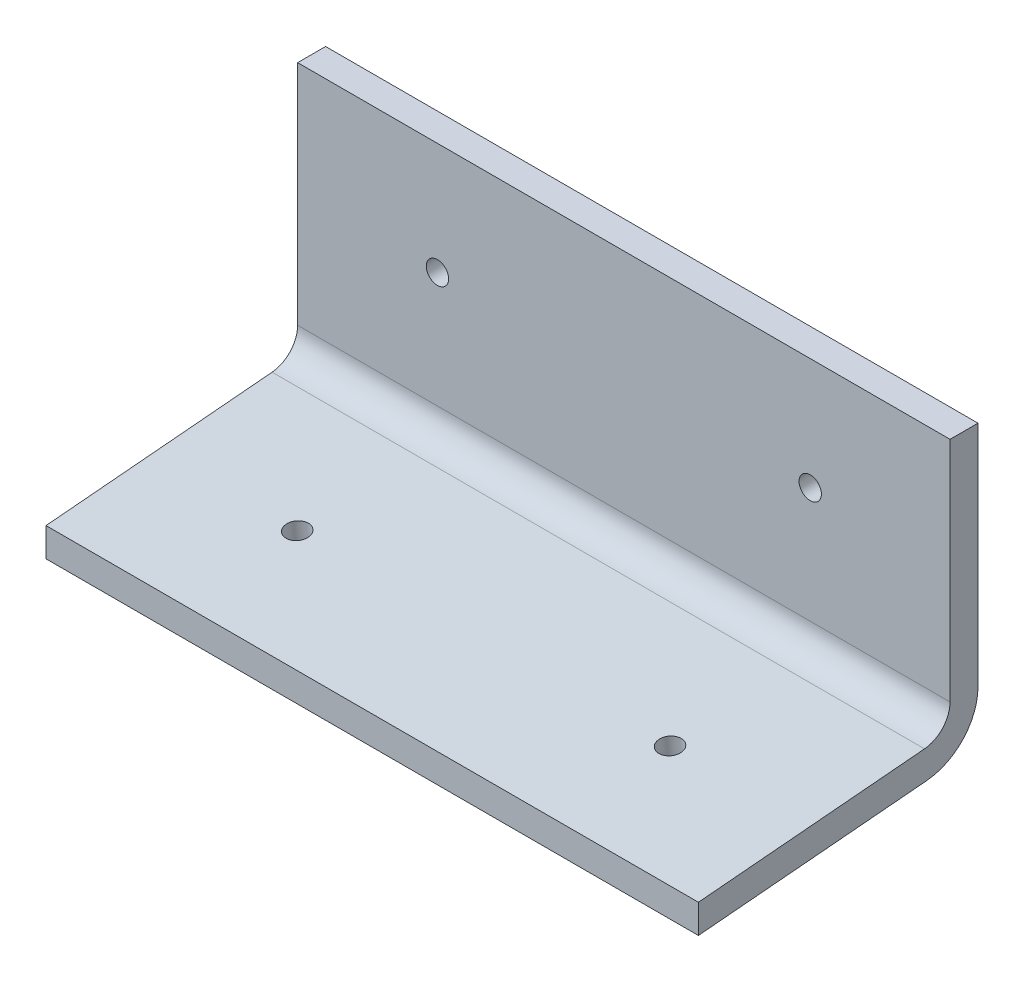
ISO-10303-21;
HEADER;
FILE_DESCRIPTION(('STEP AP214'),'2;1');
FILE_NAME('part.step','',(''),(''),'','','');
FILE_SCHEMA(('AUTOMOTIVE_DESIGN { 1 0 10303 214 1 1 1 1 }'));
ENDSEC;
DATA;
#1=APPLICATION_CONTEXT('core data for automotive mechanical design processes');
#2=APPLICATION_PROTOCOL_DEFINITION('international standard','automotive_design',2000,#1);
#3=PRODUCT_CONTEXT('',#1,'mechanical');
#4=PRODUCT('Part','Part','',(#3));
#5=PRODUCT_RELATED_PRODUCT_CATEGORY('part','',(#4));
#6=PRODUCT_DEFINITION_FORMATION('','',#4);
#7=PRODUCT_DEFINITION_CONTEXT('part definition',#1,'design');
#8=PRODUCT_DEFINITION('design','',#6,#7);
#9=PRODUCT_DEFINITION_SHAPE('','',#8);
#10=(LENGTH_UNIT() NAMED_UNIT(*) SI_UNIT(.MILLI.,.METRE.));
#11=(NAMED_UNIT(*) PLANE_ANGLE_UNIT() SI_UNIT($,.RADIAN.));
#12=(NAMED_UNIT(*) SI_UNIT($,.STERADIAN.) SOLID_ANGLE_UNIT());
#13=UNCERTAINTY_MEASURE_WITH_UNIT(LENGTH_MEASURE(1.E-05),#10,'distance_accuracy_value','');
#14=(GEOMETRIC_REPRESENTATION_CONTEXT(3) GLOBAL_UNCERTAINTY_ASSIGNED_CONTEXT((#13)) GLOBAL_UNIT_ASSIGNED_CONTEXT((#10,
#11,#12)) REPRESENTATION_CONTEXT('',''));
#15=CARTESIAN_POINT('',(0.,0.,0.));
#16=DIRECTION('',(0.,0.,1.));
#17=DIRECTION('',(1.,0.,0.));
#18=AXIS2_PLACEMENT_3D('',#15,#16,#17);
#19=CARTESIAN_POINT('',(88.9,-38.687429959831,6.95587324026287));
#20=DIRECTION('',(0.,-0.996194698091746,-0.0871557427476543));
#21=DIRECTION('',(0.,0.0871557427476543,-0.996194698091746));
#22=AXIS2_PLACEMENT_3D('',#19,#20,#21);
#23=PLANE('',#22);
#24=DIRECTION('',(0.,-0.0871557427476543,0.996194698091746));
#25=VECTOR('',#24,1.);
#26=CARTESIAN_POINT('',(0.,-38.687429959831,6.95587324026287));
#27=LINE('',#26,#25);
#28=CARTESIAN_POINT('',(0.,-38.687429959831,6.95587324026287));
#29=VERTEX_POINT('',#28);
#30=CARTESIAN_POINT('',(0.,-41.4121879867222,38.1));
#31=VERTEX_POINT('',#30);
#32=EDGE_CURVE('E131',#29,#31,#27,.T.);
#33=ORIENTED_EDGE('',*,*,#32,.F.);
#34=DIRECTION('',(-1.,0.,0.));
#35=VECTOR('',#34,1.);
#36=CARTESIAN_POINT('',(88.9,-38.687429959831,6.95587324026287));
#37=LINE('',#36,#35);
#38=CARTESIAN_POINT('',(88.9,-38.687429959831,6.95587324026287));
#39=VERTEX_POINT('',#38);
#40=EDGE_CURVE('E11',#39,#29,#37,.T.);
#41=ORIENTED_EDGE('',*,*,#40,.F.);
#42=DIRECTION('',(0.,-0.0871557427476543,0.996194698091746));
#43=VECTOR('',#42,1.);
#44=CARTESIAN_POINT('',(88.9,-38.687429959831,6.95587324026287));
#45=LINE('',#44,#43);
#46=CARTESIAN_POINT('',(88.9,-41.4121879867222,38.1));
#47=VERTEX_POINT('',#46);
#48=EDGE_CURVE('E151',#39,#47,#45,.T.);
#49=ORIENTED_EDGE('',*,*,#48,.T.);
#50=DIRECTION('',(-1.,0.,0.));
#51=VECTOR('',#50,1.);
#52=CARTESIAN_POINT('',(88.9,-41.4121879867222,38.1));
#53=LINE('',#52,#51);
#54=EDGE_CURVE('E36',#47,#31,#53,.T.);
#55=ORIENTED_EDGE('',*,*,#54,.T.);
#56=EDGE_LOOP('',(#33,#41,#49,#55));
#57=FACE_BOUND('',#56,.T.);
#58=CARTESIAN_POINT('',(19.05,-40.0541139069076,22.577142236694));
#59=DIRECTION('',(0.,-0.996194698091746,-0.0871557427476543));
#60=DIRECTION('',(0.,0.0871557427476543,-0.996194698091746));
#61=AXIS2_PLACEMENT_3D('',#58,#59,#60);
#62=CIRCLE('',#61,1.524);
#63=CARTESIAN_POINT('',(19.05,-39.9212885549602,21.0589415168022));
#64=VERTEX_POINT('',#63);
#65=EDGE_CURVE('E194',#64,#64,#62,.T.);
#66=ORIENTED_EDGE('',*,*,#65,.F.);
#67=EDGE_LOOP('',(#66));
#68=FACE_BOUND('',#67,.T.);
#69=CARTESIAN_POINT('',(69.85,-40.0541139069076,22.577142236694));
#70=DIRECTION('',(0.,-0.996194698091746,-0.0871557427476543));
#71=DIRECTION('',(0.,0.0871557427476543,-0.996194698091746));
#72=AXIS2_PLACEMENT_3D('',#69,#70,#71);
#73=CIRCLE('',#72,1.52400000000001);
#74=CARTESIAN_POINT('',(69.85,-39.9212885549602,21.0589415168022));
#75=VERTEX_POINT('',#74);
#76=EDGE_CURVE('E198',#75,#75,#73,.F.);
#77=ORIENTED_EDGE('',*,*,#76,.T.);
#78=EDGE_LOOP('',(#77));
#79=FACE_BOUND('',#78,.T.);
#80=ADVANCED_FACE('F33',(#57,#68,#79),#23,.T.);
#81=CARTESIAN_POINT('',(88.9,-34.7907214024233,7.28793662013143));
#82=DIRECTION('',(0.,-0.996194698091746,-0.0871557427476545));
#83=DIRECTION('',(0.,0.0871557427476545,-0.996194698091746));
#84=AXIS2_PLACEMENT_3D('',#81,#82,#83);
#85=PLANE('',#84);
#86=CARTESIAN_POINT('',(19.05,-36.1581741285297,22.9179928010818));
#87=DIRECTION('',(0.,0.996194698091746,0.0871557427476545));
#88=DIRECTION('',(0.,-0.0871557427476545,0.996194698091746));
#89=AXIS2_PLACEMENT_3D('',#86,#87,#88);
#90=CIRCLE('',#89,1.524);
#91=CARTESIAN_POINT('',(19.05,-36.2909994804771,24.4361935209736));
#92=VERTEX_POINT('',#91);
#93=EDGE_CURVE('E195',#92,#92,#90,.T.);
#94=ORIENTED_EDGE('',*,*,#93,.F.);
#95=EDGE_LOOP('',(#94));
#96=FACE_BOUND('',#95,.T.);
#97=DIRECTION('',(0.,-0.0871557427476545,0.996194698091746));
#98=VECTOR('',#97,1.);
#99=CARTESIAN_POINT('',(0.,-34.7907214024233,7.28793662013143));
#100=LINE('',#99,#98);
#101=CARTESIAN_POINT('',(0.,-34.7907214024233,7.28793662013143));
#102=VERTEX_POINT('',#101);
#103=CARTESIAN_POINT('',(0.,-37.486427648004,38.1));
#104=VERTEX_POINT('',#103);
#105=EDGE_CURVE('E138',#102,#104,#100,.T.);
#106=ORIENTED_EDGE('',*,*,#105,.T.);
#107=DIRECTION('',(-1.,0.,0.));
#108=VECTOR('',#107,1.);
#109=CARTESIAN_POINT('',(88.9,-37.486427648004,38.1));
#110=LINE('',#109,#108);
#111=CARTESIAN_POINT('',(88.9,-37.486427648004,38.1));
#112=VERTEX_POINT('',#111);
#113=EDGE_CURVE('E158',#112,#104,#110,.T.);
#114=ORIENTED_EDGE('',*,*,#113,.F.);
#115=DIRECTION('',(0.,-0.0871557427476545,0.996194698091746));
#116=VECTOR('',#115,1.);
#117=CARTESIAN_POINT('',(88.9,-34.7907214024233,7.28793662013143));
#118=LINE('',#117,#116);
#119=CARTESIAN_POINT('',(88.9,-34.7907214024233,7.28793662013143));
#120=VERTEX_POINT('',#119);
#121=EDGE_CURVE('E168',#120,#112,#118,.T.);
#122=ORIENTED_EDGE('',*,*,#121,.F.);
#123=DIRECTION('',(-1.,0.,0.));
#124=VECTOR('',#123,1.);
#125=CARTESIAN_POINT('',(88.9,-34.7907214024233,7.28793662013143));
#126=LINE('',#125,#124);
#127=EDGE_CURVE('E157',#120,#102,#126,.T.);
#128=ORIENTED_EDGE('',*,*,#127,.T.);
#129=EDGE_LOOP('',(#106,#114,#122,#128));
#130=FACE_BOUND('',#129,.T.);
#131=CARTESIAN_POINT('',(69.85,-36.1581741285297,22.9179928010818));
#132=DIRECTION('',(0.,0.996194698091746,0.0871557427476546));
#133=DIRECTION('',(0.,-0.0871557427476546,0.996194698091746));
#134=AXIS2_PLACEMENT_3D('',#131,#132,#133);
#135=CIRCLE('',#134,1.52400000000001);
#136=CARTESIAN_POINT('',(69.85,-36.2909994804771,24.4361935209736));
#137=VERTEX_POINT('',#136);
#138=EDGE_CURVE('E192',#137,#137,#135,.F.);
#139=ORIENTED_EDGE('',*,*,#138,.T.);
#140=EDGE_LOOP('',(#139));
#141=FACE_BOUND('',#140,.T.);
#142=ADVANCED_FACE('F185',(#96,#130,#141),#85,.F.);
#143=CARTESIAN_POINT('',(88.9,0.,0.));
#144=DIRECTION('',(0.,0.,-1.));
#145=DIRECTION('',(0.,1.,0.));
#146=AXIS2_PLACEMENT_3D('',#143,#144,#145);
#147=PLANE('',#146);
#148=DIRECTION('',(0.,-1.,0.));
#149=VECTOR('',#148,1.);
#150=CARTESIAN_POINT('',(0.,0.,0.));
#151=LINE('',#150,#149);
#152=CARTESIAN_POINT('',(0.,0.,0.));
#153=VERTEX_POINT('',#152);
#154=CARTESIAN_POINT('',(0.,-31.0964263603719,0.));
#155=VERTEX_POINT('',#154);
#156=EDGE_CURVE('E108',#153,#155,#151,.T.);
#157=ORIENTED_EDGE('',*,*,#156,.F.);
#158=DIRECTION('',(-1.,0.,0.));
#159=VECTOR('',#158,1.);
#160=CARTESIAN_POINT('',(88.9,0.,0.));
#161=LINE('',#160,#159);
#162=CARTESIAN_POINT('',(88.9,0.,0.));
#163=VERTEX_POINT('',#162);
#164=EDGE_CURVE('E102',#163,#153,#161,.T.);
#165=ORIENTED_EDGE('',*,*,#164,.F.);
#166=DIRECTION('',(0.,-1.,0.));
#167=VECTOR('',#166,1.);
#168=CARTESIAN_POINT('',(88.9,0.,0.));
#169=LINE('',#168,#167);
#170=CARTESIAN_POINT('',(88.9,-31.0964263603719,0.));
#171=VERTEX_POINT('',#170);
#172=EDGE_CURVE('E106',#163,#171,#169,.T.);
#173=ORIENTED_EDGE('',*,*,#172,.T.);
#174=DIRECTION('',(-1.,0.,0.));
#175=VECTOR('',#174,1.);
#176=CARTESIAN_POINT('',(88.9,-31.0964263603719,0.));
#177=LINE('',#176,#175);
#178=EDGE_CURVE('E42',#171,#155,#177,.T.);
#179=ORIENTED_EDGE('',*,*,#178,.T.);
#180=EDGE_LOOP('',(#157,#165,#173,#179));
#181=FACE_BOUND('',#180,.T.);
#182=CARTESIAN_POINT('',(19.05,-15.24,0.));
#183=DIRECTION('',(0.,0.,-1.));
#184=DIRECTION('',(0.,1.,0.));
#185=AXIS2_PLACEMENT_3D('',#182,#183,#184);
#186=CIRCLE('',#185,1.524);
#187=CARTESIAN_POINT('',(19.05,-13.716,0.));
#188=VERTEX_POINT('',#187);
#189=EDGE_CURVE('E209',#188,#188,#186,.T.);
#190=ORIENTED_EDGE('',*,*,#189,.F.);
#191=EDGE_LOOP('',(#190));
#192=FACE_BOUND('',#191,.T.);
#193=CARTESIAN_POINT('',(69.85,-15.24,0.));
#194=DIRECTION('',(0.,0.,-1.));
#195=DIRECTION('',(0.,1.,0.));
#196=AXIS2_PLACEMENT_3D('',#193,#194,#195);
#197=CIRCLE('',#196,1.52400000000001);
#198=CARTESIAN_POINT('',(69.85,-13.716,0.));
#199=VERTEX_POINT('',#198);
#200=EDGE_CURVE('E135',#199,#199,#197,.F.);
#201=ORIENTED_EDGE('',*,*,#200,.T.);
#202=EDGE_LOOP('',(#201));
#203=FACE_BOUND('',#202,.T.);
#204=ADVANCED_FACE('F104',(#181,#192,#203),#147,.T.);
#205=CARTESIAN_POINT('',(88.9,0.,3.81));
#206=DIRECTION('',(0.,0.,-1.));
#207=DIRECTION('',(0.,1.,0.));
#208=AXIS2_PLACEMENT_3D('',#205,#206,#207);
#209=PLANE('',#208);
#210=CARTESIAN_POINT('',(19.05,-15.24,3.81));
#211=DIRECTION('',(0.,0.,1.));
#212=DIRECTION('',(1.,0.,0.));
#213=AXIS2_PLACEMENT_3D('',#210,#211,#212);
#214=CIRCLE('',#213,1.524);
#215=CARTESIAN_POINT('',(20.574,-15.24,3.81));
#216=VERTEX_POINT('',#215);
#217=EDGE_CURVE('E205',#216,#216,#214,.T.);
#218=ORIENTED_EDGE('',*,*,#217,.F.);
#219=EDGE_LOOP('',(#218));
#220=FACE_BOUND('',#219,.T.);
#221=DIRECTION('',(0.,-1.,0.));
#222=VECTOR('',#221,1.);
#223=CARTESIAN_POINT('',(0.,0.,3.81));
#224=LINE('',#223,#222);
#225=CARTESIAN_POINT('',(0.,0.,3.81));
#226=VERTEX_POINT('',#225);
#227=CARTESIAN_POINT('',(0.,-30.9952196026938,3.81));
#228=VERTEX_POINT('',#227);
#229=EDGE_CURVE('E144',#226,#228,#224,.T.);
#230=ORIENTED_EDGE('',*,*,#229,.T.);
#231=DIRECTION('',(-1.,0.,0.));
#232=VECTOR('',#231,1.);
#233=CARTESIAN_POINT('',(88.9,-30.9952196026938,3.81));
#234=LINE('',#233,#232);
#235=CARTESIAN_POINT('',(88.9,-30.9952196026938,3.81));
#236=VERTEX_POINT('',#235);
#237=EDGE_CURVE('E155',#236,#228,#234,.T.);
#238=ORIENTED_EDGE('',*,*,#237,.F.);
#239=DIRECTION('',(0.,-1.,0.));
#240=VECTOR('',#239,1.);
#241=CARTESIAN_POINT('',(88.9,0.,3.81));
#242=LINE('',#241,#240);
#243=CARTESIAN_POINT('',(88.9,0.,3.81));
#244=VERTEX_POINT('',#243);
#245=EDGE_CURVE('E124',#244,#236,#242,.T.);
#246=ORIENTED_EDGE('',*,*,#245,.F.);
#247=DIRECTION('',(-1.,0.,0.));
#248=VECTOR('',#247,1.);
#249=CARTESIAN_POINT('',(88.9,0.,3.81));
#250=LINE('',#249,#248);
#251=EDGE_CURVE('E113',#244,#226,#250,.T.);
#252=ORIENTED_EDGE('',*,*,#251,.T.);
#253=EDGE_LOOP('',(#230,#238,#246,#252));
#254=FACE_BOUND('',#253,.T.);
#255=CARTESIAN_POINT('',(69.85,-15.24,3.81));
#256=DIRECTION('',(0.,0.,1.));
#257=DIRECTION('',(1.,0.,0.));
#258=AXIS2_PLACEMENT_3D('',#255,#256,#257);
#259=CIRCLE('',#258,1.52400000000001);
#260=CARTESIAN_POINT('',(71.374,-15.24,3.81));
#261=VERTEX_POINT('',#260);
#262=EDGE_CURVE('E206',#261,#261,#259,.F.);
#263=ORIENTED_EDGE('',*,*,#262,.T.);
#264=EDGE_LOOP('',(#263));
#265=FACE_BOUND('',#264,.T.);
#266=ADVANCED_FACE('F181',(#220,#254,#265),#209,.F.);
#267=CARTESIAN_POINT('',(88.9,-31.0964263603719,7.61999999999999));
#268=DIRECTION('',(-1.,0.,0.));
#269=DIRECTION('',(0.,0.,1.));
#270=AXIS2_PLACEMENT_3D('',#267,#268,#269);
#271=CYLINDRICAL_SURFACE('',#270,7.62);
#272=CARTESIAN_POINT('',(0.,-31.0964263603719,7.61999999999999));
#273=DIRECTION('',(1.,0.,0.));
#274=DIRECTION('',(0.,0.,-1.));
#275=AXIS2_PLACEMENT_3D('',#272,#273,#274);
#276=CIRCLE('',#275,7.62);
#277=EDGE_CURVE('E150',#29,#155,#276,.T.);
#278=ORIENTED_EDGE('',*,*,#277,.T.);
#279=ORIENTED_EDGE('',*,*,#178,.F.);
#280=CARTESIAN_POINT('',(88.9,-31.0964263603719,7.61999999999999));
#281=DIRECTION('',(1.,0.,0.));
#282=DIRECTION('',(0.,0.,-1.));
#283=AXIS2_PLACEMENT_3D('',#280,#281,#282);
#284=CIRCLE('',#283,7.62);
#285=EDGE_CURVE('E120',#39,#171,#284,.T.);
#286=ORIENTED_EDGE('',*,*,#285,.F.);
#287=ORIENTED_EDGE('',*,*,#40,.T.);
#288=EDGE_LOOP('',(#278,#279,#286,#287));
#289=FACE_BOUND('',#288,.T.);
#290=ADVANCED_FACE('F165',(#289),#271,.T.);
#291=CARTESIAN_POINT('',(88.9,0.,3.81));
#292=DIRECTION('',(0.,1.,0.));
#293=DIRECTION('',(0.,0.,1.));
#294=AXIS2_PLACEMENT_3D('',#291,#292,#293);
#295=PLANE('',#294);
#296=DIRECTION('',(0.,0.,-1.));
#297=VECTOR('',#296,1.);
#298=CARTESIAN_POINT('',(0.,0.,3.81));
#299=LINE('',#298,#297);
#300=EDGE_CURVE('E147',#226,#153,#299,.T.);
#301=ORIENTED_EDGE('',*,*,#300,.F.);
#302=ORIENTED_EDGE('',*,*,#251,.F.);
#303=DIRECTION('',(0.,0.,-1.));
#304=VECTOR('',#303,1.);
#305=CARTESIAN_POINT('',(88.9,0.,3.81));
#306=LINE('',#305,#304);
#307=EDGE_CURVE('E119',#244,#163,#306,.T.);
#308=ORIENTED_EDGE('',*,*,#307,.T.);
#309=ORIENTED_EDGE('',*,*,#164,.T.);
#310=EDGE_LOOP('',(#301,#302,#308,#309));
#311=FACE_BOUND('',#310,.T.);
#312=ADVANCED_FACE('F122',(#311),#295,.T.);
#313=CARTESIAN_POINT('',(88.9,-30.9952196026938,7.62));
#314=DIRECTION('',(-1.,0.,0.));
#315=DIRECTION('',(0.,0.,1.));
#316=AXIS2_PLACEMENT_3D('',#313,#314,#315);
#317=CYLINDRICAL_SURFACE('',#316,3.81);
#318=CARTESIAN_POINT('',(0.,-30.9952196026938,7.62));
#319=DIRECTION('',(1.,0.,0.));
#320=DIRECTION('',(0.,0.,-1.));
#321=AXIS2_PLACEMENT_3D('',#318,#319,#320);
#322=CIRCLE('',#321,3.81);
#323=EDGE_CURVE('E141',#102,#228,#322,.T.);
#324=ORIENTED_EDGE('',*,*,#323,.F.);
#325=ORIENTED_EDGE('',*,*,#127,.F.);
#326=CARTESIAN_POINT('',(88.9,-30.9952196026938,7.62));
#327=DIRECTION('',(1.,0.,0.));
#328=DIRECTION('',(0.,0.,-1.));
#329=AXIS2_PLACEMENT_3D('',#326,#327,#328);
#330=CIRCLE('',#329,3.81);
#331=EDGE_CURVE('E126',#120,#236,#330,.T.);
#332=ORIENTED_EDGE('',*,*,#331,.T.);
#333=ORIENTED_EDGE('',*,*,#237,.T.);
#334=EDGE_LOOP('',(#324,#325,#332,#333));
#335=FACE_BOUND('',#334,.T.);
#336=ADVANCED_FACE('F177',(#335),#317,.F.);
#337=CARTESIAN_POINT('',(88.9,-41.4121879867222,38.1));
#338=DIRECTION('',(0.,0.,1.));
#339=DIRECTION('',(0.,-1.,0.));
#340=AXIS2_PLACEMENT_3D('',#337,#338,#339);
#341=PLANE('',#340);
#342=DIRECTION('',(0.,1.,0.));
#343=VECTOR('',#342,1.);
#344=CARTESIAN_POINT('',(0.,-41.4121879867222,38.1));
#345=LINE('',#344,#343);
#346=EDGE_CURVE('E134',#31,#104,#345,.T.);
#347=ORIENTED_EDGE('',*,*,#346,.F.);
#348=ORIENTED_EDGE('',*,*,#54,.F.);
#349=DIRECTION('',(0.,1.,0.));
#350=VECTOR('',#349,1.);
#351=CARTESIAN_POINT('',(88.9,-41.4121879867222,38.1));
#352=LINE('',#351,#350);
#353=EDGE_CURVE('E166',#47,#112,#352,.T.);
#354=ORIENTED_EDGE('',*,*,#353,.T.);
#355=ORIENTED_EDGE('',*,*,#113,.T.);
#356=EDGE_LOOP('',(#347,#348,#354,#355));
#357=FACE_BOUND('',#356,.T.);
#358=ADVANCED_FACE('F161',(#357),#341,.T.);
#359=CARTESIAN_POINT('',(88.9,-30.9952196026938,7.62));
#360=DIRECTION('',(1.,0.,0.));
#361=DIRECTION('',(0.,0.,-1.));
#362=AXIS2_PLACEMENT_3D('',#359,#360,#361);
#363=PLANE('',#362);
#364=ORIENTED_EDGE('',*,*,#48,.F.);
#365=ORIENTED_EDGE('',*,*,#285,.T.);
#366=ORIENTED_EDGE('',*,*,#172,.F.);
#367=ORIENTED_EDGE('',*,*,#307,.F.);
#368=ORIENTED_EDGE('',*,*,#245,.T.);
#369=ORIENTED_EDGE('',*,*,#331,.F.);
#370=ORIENTED_EDGE('',*,*,#121,.T.);
#371=ORIENTED_EDGE('',*,*,#353,.F.);
#372=EDGE_LOOP('',(#364,#365,#366,#367,#368,#369,#370,#371));
#373=FACE_BOUND('',#372,.T.);
#374=ADVANCED_FACE('F118',(#373),#363,.T.);
#375=CARTESIAN_POINT('',(0.,-30.9952196026938,7.62));
#376=DIRECTION('',(1.,0.,0.));
#377=DIRECTION('',(0.,0.,-1.));
#378=AXIS2_PLACEMENT_3D('',#375,#376,#377);
#379=PLANE('',#378);
#380=ORIENTED_EDGE('',*,*,#32,.T.);
#381=ORIENTED_EDGE('',*,*,#346,.T.);
#382=ORIENTED_EDGE('',*,*,#105,.F.);
#383=ORIENTED_EDGE('',*,*,#323,.T.);
#384=ORIENTED_EDGE('',*,*,#229,.F.);
#385=ORIENTED_EDGE('',*,*,#300,.T.);
#386=ORIENTED_EDGE('',*,*,#156,.T.);
#387=ORIENTED_EDGE('',*,*,#277,.F.);
#388=EDGE_LOOP('',(#380,#381,#382,#383,#384,#385,#386,#387));
#389=FACE_BOUND('',#388,.T.);
#390=ADVANCED_FACE('F164',(#389),#379,.F.);
#391=CARTESIAN_POINT('',(19.05,-15.24,-85.09));
#392=DIRECTION('',(0.,0.,1.));
#393=DIRECTION('',(1.,0.,0.));
#394=AXIS2_PLACEMENT_3D('',#391,#392,#393);
#395=CYLINDRICAL_SURFACE('',#394,1.524);
#396=ORIENTED_EDGE('',*,*,#189,.T.);
#397=EDGE_LOOP('',(#396));
#398=FACE_BOUND('',#397,.T.);
#399=ORIENTED_EDGE('',*,*,#217,.T.);
#400=EDGE_LOOP('',(#399));
#401=FACE_BOUND('',#400,.T.);
#402=ADVANCED_FACE('F222',(#398,#401),#395,.F.);
#403=CARTESIAN_POINT('',(69.85,-15.24,-85.09));
#404=DIRECTION('',(0.,0.,1.));
#405=DIRECTION('',(1.,0.,0.));
#406=AXIS2_PLACEMENT_3D('',#403,#404,#405);
#407=CYLINDRICAL_SURFACE('',#406,1.52400000000001);
#408=ORIENTED_EDGE('',*,*,#200,.F.);
#409=EDGE_LOOP('',(#408));
#410=FACE_BOUND('',#409,.T.);
#411=ORIENTED_EDGE('',*,*,#262,.F.);
#412=EDGE_LOOP('',(#411));
#413=FACE_BOUND('',#412,.T.);
#414=ADVANCED_FACE('F218',(#410,#413),#407,.F.);
#415=CARTESIAN_POINT('',(19.05,-124.719882788886,15.1698472708153));
#416=DIRECTION('',(0.,0.996194698091746,0.0871557427476545));
#417=DIRECTION('',(0.,-0.0871557427476545,0.996194698091746));
#418=AXIS2_PLACEMENT_3D('',#415,#416,#417);
#419=CYLINDRICAL_SURFACE('',#418,1.524);
#420=ORIENTED_EDGE('',*,*,#65,.T.);
#421=EDGE_LOOP('',(#420));
#422=FACE_BOUND('',#421,.T.);
#423=ORIENTED_EDGE('',*,*,#93,.T.);
#424=EDGE_LOOP('',(#423));
#425=FACE_BOUND('',#424,.T.);
#426=ADVANCED_FACE('F221',(#422,#425),#419,.F.);
#427=CARTESIAN_POINT('',(69.85,-124.719882788886,15.1698472708153));
#428=DIRECTION('',(0.,0.996194698091746,0.0871557427476545));
#429=DIRECTION('',(0.,-0.0871557427476545,0.996194698091746));
#430=AXIS2_PLACEMENT_3D('',#427,#428,#429);
#431=CYLINDRICAL_SURFACE('',#430,1.52400000000001);
#432=ORIENTED_EDGE('',*,*,#76,.F.);
#433=EDGE_LOOP('',(#432));
#434=FACE_BOUND('',#433,.T.);
#435=ORIENTED_EDGE('',*,*,#138,.F.);
#436=EDGE_LOOP('',(#435));
#437=FACE_BOUND('',#436,.T.);
#438=ADVANCED_FACE('F279',(#434,#437),#431,.F.);
#439=CLOSED_SHELL('',(#80,#142,#204,#266,#290,#312,#336,#358,#374,#390,#402,#414,#426,#438));
#440=MANIFOLD_SOLID_BREP('B2',#439);
#441=ADVANCED_BREP_SHAPE_REPRESENTATION('',(#18,#440),#14);
#442=SHAPE_DEFINITION_REPRESENTATION(#9,#441);
ENDSEC;
END-ISO-10303-21;
